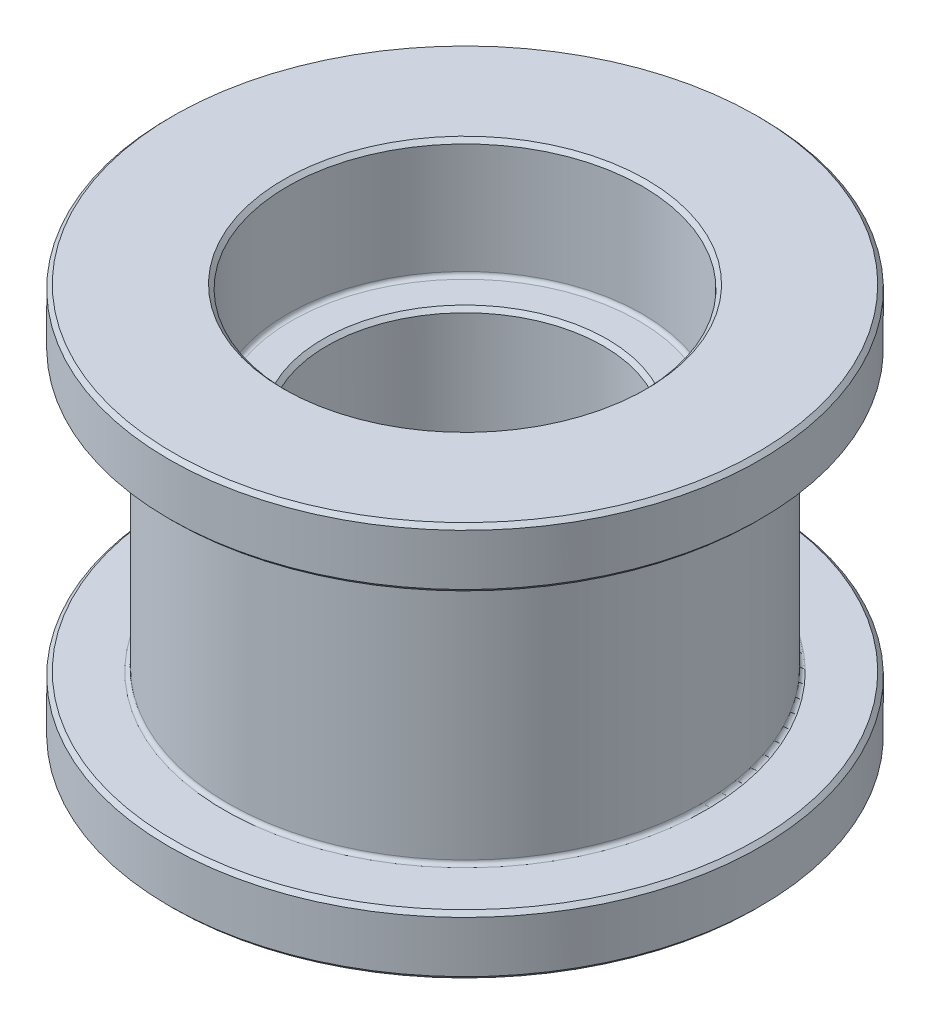
ISO-10303-21;
HEADER;
FILE_DESCRIPTION(('STEP AP214'),'2;1');
FILE_NAME('part.step','',(''),(''),'','','');
FILE_SCHEMA(('AUTOMOTIVE_DESIGN { 1 0 10303 214 1 1 1 1 }'));
ENDSEC;
DATA;
#1=APPLICATION_CONTEXT('core data for automotive mechanical design processes');
#2=APPLICATION_PROTOCOL_DEFINITION('international standard','automotive_design',2000,#1);
#3=PRODUCT_CONTEXT('',#1,'mechanical');
#4=PRODUCT('Part','Part','',(#3));
#5=PRODUCT_RELATED_PRODUCT_CATEGORY('part','',(#4));
#6=PRODUCT_DEFINITION_FORMATION('','',#4);
#7=PRODUCT_DEFINITION_CONTEXT('part definition',#1,'design');
#8=PRODUCT_DEFINITION('design','',#6,#7);
#9=PRODUCT_DEFINITION_SHAPE('','',#8);
#10=(LENGTH_UNIT() NAMED_UNIT(*) SI_UNIT(.MILLI.,.METRE.));
#11=(NAMED_UNIT(*) PLANE_ANGLE_UNIT() SI_UNIT($,.RADIAN.));
#12=(NAMED_UNIT(*) SI_UNIT($,.STERADIAN.) SOLID_ANGLE_UNIT());
#13=UNCERTAINTY_MEASURE_WITH_UNIT(LENGTH_MEASURE(1.E-05),#10,'distance_accuracy_value','');
#14=(GEOMETRIC_REPRESENTATION_CONTEXT(3) GLOBAL_UNCERTAINTY_ASSIGNED_CONTEXT((#13)) GLOBAL_UNIT_ASSIGNED_CONTEXT((#10,
#11,#12)) REPRESENTATION_CONTEXT('',''));
#15=CARTESIAN_POINT('',(0.,0.,0.));
#16=DIRECTION('',(0.,0.,1.));
#17=DIRECTION('',(1.,0.,0.));
#18=AXIS2_PLACEMENT_3D('',#15,#16,#17);
#19=CARTESIAN_POINT('',(0.,0.,0.));
#20=DIRECTION('',(0.,1.,0.));
#21=DIRECTION('',(0.,0.,1.));
#22=AXIS2_PLACEMENT_3D('',#19,#20,#21);
#23=CYLINDRICAL_SURFACE('',#22,4.5);
#24=CARTESIAN_POINT('',(0.,7.1,0.));
#25=DIRECTION('',(0.,-1.,0.));
#26=DIRECTION('',(0.,0.,-1.));
#27=AXIS2_PLACEMENT_3D('',#24,#25,#26);
#28=CIRCLE('',#27,4.5);
#29=CARTESIAN_POINT('',(0.,7.1,-4.5));
#30=VERTEX_POINT('',#29);
#31=EDGE_CURVE('E10',#30,#30,#28,.T.);
#32=ORIENTED_EDGE('',*,*,#31,.T.);
#33=EDGE_LOOP('',(#32));
#34=FACE_BOUND('',#33,.T.);
#35=CARTESIAN_POINT('',(0.,9.9,0.));
#36=DIRECTION('',(0.,-1.,0.));
#37=DIRECTION('',(0.,0.,-1.));
#38=AXIS2_PLACEMENT_3D('',#35,#36,#37);
#39=CIRCLE('',#38,4.5);
#40=CARTESIAN_POINT('',(0.,9.9,-4.5));
#41=VERTEX_POINT('',#40);
#42=EDGE_CURVE('E63',#41,#41,#39,.F.);
#43=ORIENTED_EDGE('',*,*,#42,.T.);
#44=EDGE_LOOP('',(#43));
#45=FACE_BOUND('',#44,.T.);
#46=ADVANCED_FACE('F31',(#34,#45),#23,.F.);
#47=CARTESIAN_POINT('',(4.5,10.,0.));
#48=DIRECTION('',(0.,-1.,0.));
#49=DIRECTION('',(0.,0.,-1.));
#50=AXIS2_PLACEMENT_3D('',#47,#48,#49);
#51=PLANE('',#50);
#52=CARTESIAN_POINT('',(0.,10.,0.));
#53=DIRECTION('',(0.,-1.,0.));
#54=DIRECTION('',(0.,0.,-1.));
#55=AXIS2_PLACEMENT_3D('',#52,#53,#54);
#56=CIRCLE('',#55,7.4);
#57=CARTESIAN_POINT('',(0.,10.,-7.4));
#58=VERTEX_POINT('',#57);
#59=EDGE_CURVE('E66',#58,#58,#56,.F.);
#60=ORIENTED_EDGE('',*,*,#59,.T.);
#61=EDGE_LOOP('',(#60));
#62=FACE_BOUND('',#61,.T.);
#63=CARTESIAN_POINT('',(0.,10.,0.));
#64=DIRECTION('',(0.,-1.,0.));
#65=DIRECTION('',(0.,0.,-1.));
#66=AXIS2_PLACEMENT_3D('',#63,#64,#65);
#67=CIRCLE('',#66,4.60000000000001);
#68=CARTESIAN_POINT('',(0.,10.,-4.60000000000001));
#69=VERTEX_POINT('',#68);
#70=EDGE_CURVE('E69',#69,#69,#67,.T.);
#71=ORIENTED_EDGE('',*,*,#70,.T.);
#72=EDGE_LOOP('',(#71));
#73=FACE_BOUND('',#72,.T.);
#74=ADVANCED_FACE('F132',(#62,#73),#51,.F.);
#75=CARTESIAN_POINT('',(0.,0.,0.));
#76=DIRECTION('',(0.,1.,0.));
#77=DIRECTION('',(0.,0.,1.));
#78=AXIS2_PLACEMENT_3D('',#75,#76,#77);
#79=CYLINDRICAL_SURFACE('',#78,7.5);
#80=CARTESIAN_POINT('',(0.,8.6,0.));
#81=DIRECTION('',(0.,1.,0.));
#82=DIRECTION('',(0.,0.,1.));
#83=AXIS2_PLACEMENT_3D('',#80,#81,#82);
#84=CIRCLE('',#83,7.5);
#85=CARTESIAN_POINT('',(0.,8.6,7.5));
#86=VERTEX_POINT('',#85);
#87=EDGE_CURVE('E75',#86,#86,#84,.T.);
#88=ORIENTED_EDGE('',*,*,#87,.T.);
#89=EDGE_LOOP('',(#88));
#90=FACE_BOUND('',#89,.T.);
#91=CARTESIAN_POINT('',(0.,9.90000000000001,0.));
#92=DIRECTION('',(0.,-1.,0.));
#93=DIRECTION('',(0.,0.,-1.));
#94=AXIS2_PLACEMENT_3D('',#91,#92,#93);
#95=CIRCLE('',#94,7.5);
#96=CARTESIAN_POINT('',(0.,9.90000000000001,-7.5));
#97=VERTEX_POINT('',#96);
#98=EDGE_CURVE('E78',#97,#97,#95,.T.);
#99=ORIENTED_EDGE('',*,*,#98,.T.);
#100=EDGE_LOOP('',(#99));
#101=FACE_BOUND('',#100,.T.);
#102=ADVANCED_FACE('F136',(#90,#101),#79,.T.);
#103=CARTESIAN_POINT('',(7.5,8.5,0.));
#104=DIRECTION('',(0.,1.,0.));
#105=DIRECTION('',(0.,0.,1.));
#106=AXIS2_PLACEMENT_3D('',#103,#104,#105);
#107=PLANE('',#106);
#108=CARTESIAN_POINT('',(0.,8.5,0.));
#109=DIRECTION('',(0.,1.,0.));
#110=DIRECTION('',(0.,0.,1.));
#111=AXIS2_PLACEMENT_3D('',#108,#109,#110);
#112=CIRCLE('',#111,6.1);
#113=CARTESIAN_POINT('',(0.,8.5,6.1));
#114=VERTEX_POINT('',#113);
#115=EDGE_CURVE('E42',#114,#114,#112,.T.);
#116=ORIENTED_EDGE('',*,*,#115,.T.);
#117=EDGE_LOOP('',(#116));
#118=FACE_BOUND('',#117,.T.);
#119=CARTESIAN_POINT('',(0.,8.5,0.));
#120=DIRECTION('',(0.,1.,0.));
#121=DIRECTION('',(0.,0.,1.));
#122=AXIS2_PLACEMENT_3D('',#119,#120,#121);
#123=CIRCLE('',#122,7.4);
#124=CARTESIAN_POINT('',(0.,8.5,7.4));
#125=VERTEX_POINT('',#124);
#126=EDGE_CURVE('E72',#125,#125,#123,.F.);
#127=ORIENTED_EDGE('',*,*,#126,.T.);
#128=EDGE_LOOP('',(#127));
#129=FACE_BOUND('',#128,.T.);
#130=ADVANCED_FACE('F143',(#118,#129),#107,.F.);
#131=CARTESIAN_POINT('',(0.,0.,0.));
#132=DIRECTION('',(0.,1.,0.));
#133=DIRECTION('',(0.,0.,1.));
#134=AXIS2_PLACEMENT_3D('',#131,#132,#133);
#135=CYLINDRICAL_SURFACE('',#134,6.);
#136=CARTESIAN_POINT('',(0.,1.6,0.));
#137=DIRECTION('',(0.,-1.,0.));
#138=DIRECTION('',(0.,0.,-1.));
#139=AXIS2_PLACEMENT_3D('',#136,#137,#138);
#140=CIRCLE('',#139,6.);
#141=CARTESIAN_POINT('',(0.,1.6,-6.));
#142=VERTEX_POINT('',#141);
#143=EDGE_CURVE('E51',#142,#142,#140,.F.);
#144=ORIENTED_EDGE('',*,*,#143,.T.);
#145=EDGE_LOOP('',(#144));
#146=FACE_BOUND('',#145,.T.);
#147=CARTESIAN_POINT('',(0.,8.4,0.));
#148=DIRECTION('',(0.,1.,0.));
#149=DIRECTION('',(0.,0.,1.));
#150=AXIS2_PLACEMENT_3D('',#147,#148,#149);
#151=CIRCLE('',#150,6.);
#152=CARTESIAN_POINT('',(0.,8.4,6.));
#153=VERTEX_POINT('',#152);
#154=EDGE_CURVE('E54',#153,#153,#151,.F.);
#155=ORIENTED_EDGE('',*,*,#154,.T.);
#156=EDGE_LOOP('',(#155));
#157=FACE_BOUND('',#156,.T.);
#158=ADVANCED_FACE('F147',(#146,#157),#135,.T.);
#159=CARTESIAN_POINT('',(6.,1.5,0.));
#160=DIRECTION('',(0.,-1.,0.));
#161=DIRECTION('',(0.,0.,-1.));
#162=AXIS2_PLACEMENT_3D('',#159,#160,#161);
#163=PLANE('',#162);
#164=CARTESIAN_POINT('',(0.,1.5,0.));
#165=DIRECTION('',(0.,-1.,0.));
#166=DIRECTION('',(0.,0.,-1.));
#167=AXIS2_PLACEMENT_3D('',#164,#165,#166);
#168=CIRCLE('',#167,6.1);
#169=CARTESIAN_POINT('',(0.,1.5,-6.1));
#170=VERTEX_POINT('',#169);
#171=EDGE_CURVE('E46',#170,#170,#168,.T.);
#172=ORIENTED_EDGE('',*,*,#171,.T.);
#173=EDGE_LOOP('',(#172));
#174=FACE_BOUND('',#173,.T.);
#175=CARTESIAN_POINT('',(0.,1.5,0.));
#176=DIRECTION('',(0.,-1.,0.));
#177=DIRECTION('',(0.,0.,-1.));
#178=AXIS2_PLACEMENT_3D('',#175,#176,#177);
#179=CIRCLE('',#178,7.4);
#180=CARTESIAN_POINT('',(0.,1.5,-7.4));
#181=VERTEX_POINT('',#180);
#182=EDGE_CURVE('E81',#181,#181,#179,.F.);
#183=ORIENTED_EDGE('',*,*,#182,.T.);
#184=EDGE_LOOP('',(#183));
#185=FACE_BOUND('',#184,.T.);
#186=ADVANCED_FACE('F151',(#174,#185),#163,.F.);
#187=CARTESIAN_POINT('',(0.,0.,0.));
#188=DIRECTION('',(0.,1.,0.));
#189=DIRECTION('',(0.,0.,1.));
#190=AXIS2_PLACEMENT_3D('',#187,#188,#189);
#191=CYLINDRICAL_SURFACE('',#190,7.5);
#192=CARTESIAN_POINT('',(0.,0.0999999999999951,0.));
#193=DIRECTION('',(0.,1.,0.));
#194=DIRECTION('',(0.,0.,1.));
#195=AXIS2_PLACEMENT_3D('',#192,#193,#194);
#196=CIRCLE('',#195,7.5);
#197=CARTESIAN_POINT('',(0.,0.0999999999999951,7.5));
#198=VERTEX_POINT('',#197);
#199=EDGE_CURVE('E84',#198,#198,#196,.T.);
#200=ORIENTED_EDGE('',*,*,#199,.T.);
#201=EDGE_LOOP('',(#200));
#202=FACE_BOUND('',#201,.T.);
#203=CARTESIAN_POINT('',(0.,1.4,0.));
#204=DIRECTION('',(0.,-1.,0.));
#205=DIRECTION('',(0.,0.,-1.));
#206=AXIS2_PLACEMENT_3D('',#203,#204,#205);
#207=CIRCLE('',#206,7.5);
#208=CARTESIAN_POINT('',(0.,1.4,-7.5));
#209=VERTEX_POINT('',#208);
#210=EDGE_CURVE('E87',#209,#209,#207,.T.);
#211=ORIENTED_EDGE('',*,*,#210,.T.);
#212=EDGE_LOOP('',(#211));
#213=FACE_BOUND('',#212,.T.);
#214=ADVANCED_FACE('F155',(#202,#213),#191,.T.);
#215=CARTESIAN_POINT('',(7.5,0.,0.));
#216=DIRECTION('',(0.,1.,0.));
#217=DIRECTION('',(0.,0.,1.));
#218=AXIS2_PLACEMENT_3D('',#215,#216,#217);
#219=PLANE('',#218);
#220=CARTESIAN_POINT('',(0.,0.,0.));
#221=DIRECTION('',(0.,1.,0.));
#222=DIRECTION('',(0.,0.,1.));
#223=AXIS2_PLACEMENT_3D('',#220,#221,#222);
#224=CIRCLE('',#223,4.6);
#225=CARTESIAN_POINT('',(0.,0.,4.6));
#226=VERTEX_POINT('',#225);
#227=EDGE_CURVE('E96',#226,#226,#224,.T.);
#228=ORIENTED_EDGE('',*,*,#227,.T.);
#229=EDGE_LOOP('',(#228));
#230=FACE_BOUND('',#229,.T.);
#231=CARTESIAN_POINT('',(0.,0.,0.));
#232=DIRECTION('',(0.,1.,0.));
#233=DIRECTION('',(0.,0.,1.));
#234=AXIS2_PLACEMENT_3D('',#231,#232,#233);
#235=CIRCLE('',#234,7.4);
#236=CARTESIAN_POINT('',(0.,0.,7.4));
#237=VERTEX_POINT('',#236);
#238=EDGE_CURVE('E99',#237,#237,#235,.F.);
#239=ORIENTED_EDGE('',*,*,#238,.T.);
#240=EDGE_LOOP('',(#239));
#241=FACE_BOUND('',#240,.T.);
#242=ADVANCED_FACE('F159',(#230,#241),#219,.F.);
#243=CARTESIAN_POINT('',(0.,0.,0.));
#244=DIRECTION('',(0.,1.,0.));
#245=DIRECTION('',(0.,0.,1.));
#246=AXIS2_PLACEMENT_3D('',#243,#244,#245);
#247=CYLINDRICAL_SURFACE('',#246,4.5);
#248=CARTESIAN_POINT('',(0.,2.9,0.));
#249=DIRECTION('',(0.,1.,0.));
#250=DIRECTION('',(0.,0.,1.));
#251=AXIS2_PLACEMENT_3D('',#248,#249,#250);
#252=CIRCLE('',#251,4.5);
#253=CARTESIAN_POINT('',(0.,2.9,4.5));
#254=VERTEX_POINT('',#253);
#255=EDGE_CURVE('E60',#254,#254,#252,.T.);
#256=ORIENTED_EDGE('',*,*,#255,.T.);
#257=EDGE_LOOP('',(#256));
#258=FACE_BOUND('',#257,.T.);
#259=CARTESIAN_POINT('',(0.,0.0999999999999994,0.));
#260=DIRECTION('',(0.,1.,0.));
#261=DIRECTION('',(0.,0.,1.));
#262=AXIS2_PLACEMENT_3D('',#259,#260,#261);
#263=CIRCLE('',#262,4.5);
#264=CARTESIAN_POINT('',(0.,0.0999999999999994,4.5));
#265=VERTEX_POINT('',#264);
#266=EDGE_CURVE('E93',#265,#265,#263,.F.);
#267=ORIENTED_EDGE('',*,*,#266,.T.);
#268=EDGE_LOOP('',(#267));
#269=FACE_BOUND('',#268,.T.);
#270=ADVANCED_FACE('F163',(#258,#269),#247,.F.);
#271=CARTESIAN_POINT('',(3.5,3.,0.));
#272=DIRECTION('',(0.,1.,0.));
#273=DIRECTION('',(0.,0.,1.));
#274=AXIS2_PLACEMENT_3D('',#271,#272,#273);
#275=PLANE('',#274);
#276=CARTESIAN_POINT('',(0.,3.,0.));
#277=DIRECTION('',(0.,1.,0.));
#278=DIRECTION('',(0.,0.,1.));
#279=AXIS2_PLACEMENT_3D('',#276,#277,#278);
#280=CIRCLE('',#279,4.4);
#281=CARTESIAN_POINT('',(0.,3.,4.4));
#282=VERTEX_POINT('',#281);
#283=EDGE_CURVE('E57',#282,#282,#280,.F.);
#284=ORIENTED_EDGE('',*,*,#283,.T.);
#285=EDGE_LOOP('',(#284));
#286=FACE_BOUND('',#285,.T.);
#287=CARTESIAN_POINT('',(0.,3.,0.));
#288=DIRECTION('',(0.,1.,0.));
#289=DIRECTION('',(0.,0.,1.));
#290=AXIS2_PLACEMENT_3D('',#287,#288,#289);
#291=CIRCLE('',#290,3.6);
#292=CARTESIAN_POINT('',(0.,3.,3.6));
#293=VERTEX_POINT('',#292);
#294=EDGE_CURVE('E108',#293,#293,#291,.T.);
#295=ORIENTED_EDGE('',*,*,#294,.T.);
#296=EDGE_LOOP('',(#295));
#297=FACE_BOUND('',#296,.T.);
#298=ADVANCED_FACE('F112',(#286,#297),#275,.F.);
#299=CARTESIAN_POINT('',(0.,0.,0.));
#300=DIRECTION('',(0.,1.,0.));
#301=DIRECTION('',(0.,0.,1.));
#302=AXIS2_PLACEMENT_3D('',#299,#300,#301);
#303=CYLINDRICAL_SURFACE('',#302,3.5);
#304=CARTESIAN_POINT('',(0.,3.1,0.));
#305=DIRECTION('',(0.,1.,0.));
#306=DIRECTION('',(0.,0.,1.));
#307=AXIS2_PLACEMENT_3D('',#304,#305,#306);
#308=CIRCLE('',#307,3.5);
#309=CARTESIAN_POINT('',(0.,3.1,3.5));
#310=VERTEX_POINT('',#309);
#311=EDGE_CURVE('E102',#310,#310,#308,.F.);
#312=ORIENTED_EDGE('',*,*,#311,.T.);
#313=EDGE_LOOP('',(#312));
#314=FACE_BOUND('',#313,.T.);
#315=CARTESIAN_POINT('',(0.,6.90000000000001,0.));
#316=DIRECTION('',(0.,-1.,0.));
#317=DIRECTION('',(0.,0.,-1.));
#318=AXIS2_PLACEMENT_3D('',#315,#316,#317);
#319=CIRCLE('',#318,3.5);
#320=CARTESIAN_POINT('',(0.,6.90000000000001,-3.5));
#321=VERTEX_POINT('',#320);
#322=EDGE_CURVE('E105',#321,#321,#319,.F.);
#323=ORIENTED_EDGE('',*,*,#322,.T.);
#324=EDGE_LOOP('',(#323));
#325=FACE_BOUND('',#324,.T.);
#326=ADVANCED_FACE('F127',(#314,#325),#303,.F.);
#327=CARTESIAN_POINT('',(4.5,7.,0.));
#328=DIRECTION('',(0.,-1.,0.));
#329=DIRECTION('',(0.,0.,-1.));
#330=AXIS2_PLACEMENT_3D('',#327,#328,#329);
#331=PLANE('',#330);
#332=CARTESIAN_POINT('',(0.,7.,0.));
#333=DIRECTION('',(0.,-1.,0.));
#334=DIRECTION('',(0.,0.,-1.));
#335=AXIS2_PLACEMENT_3D('',#332,#333,#334);
#336=CIRCLE('',#335,4.4);
#337=CARTESIAN_POINT('',(0.,7.,-4.4));
#338=VERTEX_POINT('',#337);
#339=EDGE_CURVE('E38',#338,#338,#336,.F.);
#340=ORIENTED_EDGE('',*,*,#339,.T.);
#341=EDGE_LOOP('',(#340));
#342=FACE_BOUND('',#341,.T.);
#343=CARTESIAN_POINT('',(0.,7.,0.));
#344=DIRECTION('',(0.,-1.,0.));
#345=DIRECTION('',(0.,0.,-1.));
#346=AXIS2_PLACEMENT_3D('',#343,#344,#345);
#347=CIRCLE('',#346,3.6);
#348=CARTESIAN_POINT('',(0.,7.,-3.6));
#349=VERTEX_POINT('',#348);
#350=EDGE_CURVE('E90',#349,#349,#347,.T.);
#351=ORIENTED_EDGE('',*,*,#350,.T.);
#352=EDGE_LOOP('',(#351));
#353=FACE_BOUND('',#352,.T.);
#354=ADVANCED_FACE('F117',(#342,#353),#331,.F.);
#355=CARTESIAN_POINT('',(0.,3.,0.));
#356=DIRECTION('',(0.,-1.,0.));
#357=DIRECTION('',(0.,0.,-1.));
#358=AXIS2_PLACEMENT_3D('',#355,#356,#357);
#359=CONICAL_SURFACE('',#358,3.6,0.785398163397463);
#360=ORIENTED_EDGE('',*,*,#311,.F.);
#361=EDGE_LOOP('',(#360));
#362=FACE_BOUND('',#361,.T.);
#363=ORIENTED_EDGE('',*,*,#294,.F.);
#364=EDGE_LOOP('',(#363));
#365=FACE_BOUND('',#364,.T.);
#366=ADVANCED_FACE('F114',(#362,#365),#359,.F.);
#367=CARTESIAN_POINT('',(0.,0.,0.));
#368=DIRECTION('',(0.,-1.,0.));
#369=DIRECTION('',(0.,0.,-1.));
#370=AXIS2_PLACEMENT_3D('',#367,#368,#369);
#371=CONICAL_SURFACE('',#370,4.6,0.785398163397457);
#372=ORIENTED_EDGE('',*,*,#266,.F.);
#373=EDGE_LOOP('',(#372));
#374=FACE_BOUND('',#373,.T.);
#375=ORIENTED_EDGE('',*,*,#227,.F.);
#376=EDGE_LOOP('',(#375));
#377=FACE_BOUND('',#376,.T.);
#378=ADVANCED_FACE('F116',(#374,#377),#371,.F.);
#379=CARTESIAN_POINT('',(0.,6.90000000000001,0.));
#380=DIRECTION('',(0.,1.,0.));
#381=DIRECTION('',(0.,0.,1.));
#382=AXIS2_PLACEMENT_3D('',#379,#380,#381);
#383=CONICAL_SURFACE('',#382,3.5,0.785398163397453);
#384=ORIENTED_EDGE('',*,*,#350,.F.);
#385=EDGE_LOOP('',(#384));
#386=FACE_BOUND('',#385,.T.);
#387=ORIENTED_EDGE('',*,*,#322,.F.);
#388=EDGE_LOOP('',(#387));
#389=FACE_BOUND('',#388,.T.);
#390=ADVANCED_FACE('F124',(#386,#389),#383,.F.);
#391=CARTESIAN_POINT('',(0.,0.0999999999999951,0.));
#392=DIRECTION('',(0.,1.,0.));
#393=DIRECTION('',(0.,0.,1.));
#394=AXIS2_PLACEMENT_3D('',#391,#392,#393);
#395=CONICAL_SURFACE('',#394,7.5,0.785398163397466);
#396=ORIENTED_EDGE('',*,*,#238,.F.);
#397=EDGE_LOOP('',(#396));
#398=FACE_BOUND('',#397,.T.);
#399=ORIENTED_EDGE('',*,*,#199,.F.);
#400=EDGE_LOOP('',(#399));
#401=FACE_BOUND('',#400,.T.);
#402=ADVANCED_FACE('F179',(#398,#401),#395,.T.);
#403=CARTESIAN_POINT('',(0.,1.5,0.));
#404=DIRECTION('',(0.,-1.,0.));
#405=DIRECTION('',(0.,0.,-1.));
#406=AXIS2_PLACEMENT_3D('',#403,#404,#405);
#407=CONICAL_SURFACE('',#406,7.4,0.785398163397457);
#408=ORIENTED_EDGE('',*,*,#210,.F.);
#409=EDGE_LOOP('',(#408));
#410=FACE_BOUND('',#409,.T.);
#411=ORIENTED_EDGE('',*,*,#182,.F.);
#412=EDGE_LOOP('',(#411));
#413=FACE_BOUND('',#412,.T.);
#414=ADVANCED_FACE('F185',(#410,#413),#407,.T.);
#415=CARTESIAN_POINT('',(0.,8.6,0.));
#416=DIRECTION('',(0.,1.,0.));
#417=DIRECTION('',(0.,0.,1.));
#418=AXIS2_PLACEMENT_3D('',#415,#416,#417);
#419=CONICAL_SURFACE('',#418,7.5,0.785398163397448);
#420=ORIENTED_EDGE('',*,*,#126,.F.);
#421=EDGE_LOOP('',(#420));
#422=FACE_BOUND('',#421,.T.);
#423=ORIENTED_EDGE('',*,*,#87,.F.);
#424=EDGE_LOOP('',(#423));
#425=FACE_BOUND('',#424,.T.);
#426=ADVANCED_FACE('F192',(#422,#425),#419,.T.);
#427=CARTESIAN_POINT('',(0.,10.,0.));
#428=DIRECTION('',(0.,-1.,0.));
#429=DIRECTION('',(0.,0.,-1.));
#430=AXIS2_PLACEMENT_3D('',#427,#428,#429);
#431=CONICAL_SURFACE('',#430,7.4,0.785398163397457);
#432=ORIENTED_EDGE('',*,*,#98,.F.);
#433=EDGE_LOOP('',(#432));
#434=FACE_BOUND('',#433,.T.);
#435=ORIENTED_EDGE('',*,*,#59,.F.);
#436=EDGE_LOOP('',(#435));
#437=FACE_BOUND('',#436,.T.);
#438=ADVANCED_FACE('F196',(#434,#437),#431,.T.);
#439=CARTESIAN_POINT('',(0.,9.9,0.));
#440=DIRECTION('',(0.,1.,0.));
#441=DIRECTION('',(0.,0.,1.));
#442=AXIS2_PLACEMENT_3D('',#439,#440,#441);
#443=CONICAL_SURFACE('',#442,4.5,0.785398163397461);
#444=ORIENTED_EDGE('',*,*,#70,.F.);
#445=EDGE_LOOP('',(#444));
#446=FACE_BOUND('',#445,.T.);
#447=ORIENTED_EDGE('',*,*,#42,.F.);
#448=EDGE_LOOP('',(#447));
#449=FACE_BOUND('',#448,.T.);
#450=ADVANCED_FACE('F200',(#446,#449),#443,.F.);
#451=CARTESIAN_POINT('',(0.,2.9,0.));
#452=DIRECTION('',(0.,1.,0.));
#453=DIRECTION('',(0.,0.,1.));
#454=AXIS2_PLACEMENT_3D('',#451,#452,#453);
#455=TOROIDAL_SURFACE('',#454,4.4,0.1);
#456=ORIENTED_EDGE('',*,*,#283,.F.);
#457=EDGE_LOOP('',(#456));
#458=FACE_BOUND('',#457,.T.);
#459=ORIENTED_EDGE('',*,*,#255,.F.);
#460=EDGE_LOOP('',(#459));
#461=FACE_BOUND('',#460,.T.);
#462=ADVANCED_FACE('F204',(#458,#461),#455,.F.);
#463=CARTESIAN_POINT('',(0.,1.6,0.));
#464=DIRECTION('',(0.,-1.,0.));
#465=DIRECTION('',(0.,0.,-1.));
#466=AXIS2_PLACEMENT_3D('',#463,#464,#465);
#467=TOROIDAL_SURFACE('',#466,6.1,0.1);
#468=ORIENTED_EDGE('',*,*,#171,.F.);
#469=EDGE_LOOP('',(#468));
#470=FACE_BOUND('',#469,.T.);
#471=ORIENTED_EDGE('',*,*,#143,.F.);
#472=EDGE_LOOP('',(#471));
#473=FACE_BOUND('',#472,.T.);
#474=ADVANCED_FACE('F208',(#470,#473),#467,.F.);
#475=CARTESIAN_POINT('',(0.,8.4,0.));
#476=DIRECTION('',(0.,1.,0.));
#477=DIRECTION('',(0.,0.,1.));
#478=AXIS2_PLACEMENT_3D('',#475,#476,#477);
#479=TOROIDAL_SURFACE('',#478,6.1,0.1);
#480=ORIENTED_EDGE('',*,*,#154,.F.);
#481=EDGE_LOOP('',(#480));
#482=FACE_BOUND('',#481,.T.);
#483=ORIENTED_EDGE('',*,*,#115,.F.);
#484=EDGE_LOOP('',(#483));
#485=FACE_BOUND('',#484,.T.);
#486=ADVANCED_FACE('F211',(#482,#485),#479,.F.);
#487=CARTESIAN_POINT('',(0.,7.1,0.));
#488=DIRECTION('',(0.,-1.,0.));
#489=DIRECTION('',(0.,0.,-1.));
#490=AXIS2_PLACEMENT_3D('',#487,#488,#489);
#491=TOROIDAL_SURFACE('',#490,4.4,0.1);
#492=ORIENTED_EDGE('',*,*,#31,.F.);
#493=EDGE_LOOP('',(#492));
#494=FACE_BOUND('',#493,.T.);
#495=ORIENTED_EDGE('',*,*,#339,.F.);
#496=EDGE_LOOP('',(#495));
#497=FACE_BOUND('',#496,.T.);
#498=ADVANCED_FACE('F33',(#494,#497),#491,.F.);
#499=CLOSED_SHELL('',(#46,#74,#102,#130,#158,#186,#214,#242,#270,#298,#326,#354,#366,#378,#390,
#402,#414,#426,#438,#450,#462,#474,#486,#498));
#500=MANIFOLD_SOLID_BREP('B2',#499);
#501=ADVANCED_BREP_SHAPE_REPRESENTATION('',(#18,#500),#14);
#502=SHAPE_DEFINITION_REPRESENTATION(#9,#501);
ENDSEC;
END-ISO-10303-21;
